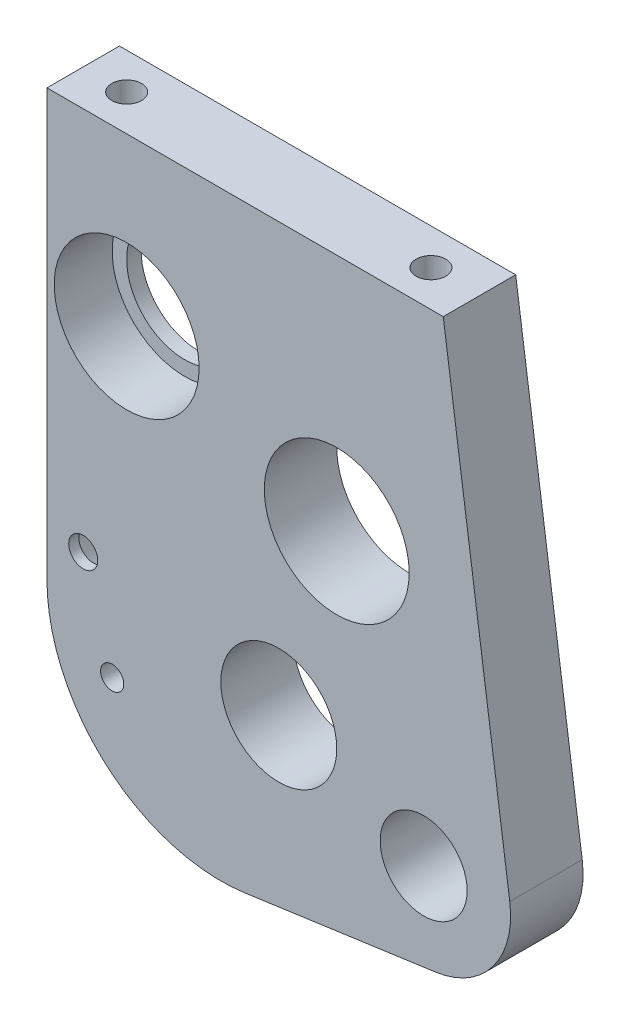
ISO-10303-21;
HEADER;
FILE_DESCRIPTION(('STEP AP214'),'2;1');
FILE_NAME('part.step','',(''),(''),'','','');
FILE_SCHEMA(('AUTOMOTIVE_DESIGN { 1 0 10303 214 1 1 1 1 }'));
ENDSEC;
DATA;
#1=APPLICATION_CONTEXT('core data for automotive mechanical design processes');
#2=APPLICATION_PROTOCOL_DEFINITION('international standard','automotive_design',2000,#1);
#3=PRODUCT_CONTEXT('',#1,'mechanical');
#4=PRODUCT('Part','Part','',(#3));
#5=PRODUCT_RELATED_PRODUCT_CATEGORY('part','',(#4));
#6=PRODUCT_DEFINITION_FORMATION('','',#4);
#7=PRODUCT_DEFINITION_CONTEXT('part definition',#1,'design');
#8=PRODUCT_DEFINITION('design','',#6,#7);
#9=PRODUCT_DEFINITION_SHAPE('','',#8);
#10=(LENGTH_UNIT() NAMED_UNIT(*) SI_UNIT(.MILLI.,.METRE.));
#11=(NAMED_UNIT(*) PLANE_ANGLE_UNIT() SI_UNIT($,.RADIAN.));
#12=(NAMED_UNIT(*) SI_UNIT($,.STERADIAN.) SOLID_ANGLE_UNIT());
#13=UNCERTAINTY_MEASURE_WITH_UNIT(LENGTH_MEASURE(1.E-05),#10,'distance_accuracy_value','');
#14=(GEOMETRIC_REPRESENTATION_CONTEXT(3) GLOBAL_UNCERTAINTY_ASSIGNED_CONTEXT((#13)) GLOBAL_UNIT_ASSIGNED_CONTEXT((#10,
#11,#12)) REPRESENTATION_CONTEXT('',''));
#15=CARTESIAN_POINT('',(0.,0.,0.));
#16=DIRECTION('',(0.,0.,1.));
#17=DIRECTION('',(1.,0.,0.));
#18=AXIS2_PLACEMENT_3D('',#15,#16,#17);
#19=CARTESIAN_POINT('',(24.,-7.35,2.5));
#20=DIRECTION('',(0.,1.,0.));
#21=DIRECTION('',(0.,0.,1.));
#22=AXIS2_PLACEMENT_3D('',#19,#20,#21);
#23=CONICAL_SURFACE('',#22,1.025,1.02974425867665);
#24=CARTESIAN_POINT('',(24.,-7.96588213450325,2.5));
#25=VERTEX_POINT('',#24);
#26=VERTEX_LOOP('',#25);
#27=FACE_BOUND('',#26,.T.);
#28=CARTESIAN_POINT('',(24.,-7.35,2.5));
#29=DIRECTION('',(0.,1.,0.));
#30=DIRECTION('',(0.,0.,1.));
#31=AXIS2_PLACEMENT_3D('',#28,#29,#30);
#32=CIRCLE('',#31,1.025);
#33=CARTESIAN_POINT('',(24.,-7.35,3.525));
#34=VERTEX_POINT('',#33);
#35=EDGE_CURVE('E283',#34,#34,#32,.T.);
#36=ORIENTED_EDGE('',*,*,#35,.T.);
#37=EDGE_LOOP('',(#36));
#38=FACE_BOUND('',#37,.T.);
#39=ADVANCED_FACE('F38',(#27,#38),#23,.F.);
#40=CARTESIAN_POINT('',(24.,0.,2.5));
#41=DIRECTION('',(0.,1.,0.));
#42=DIRECTION('',(0.,0.,1.));
#43=AXIS2_PLACEMENT_3D('',#40,#41,#42);
#44=CYLINDRICAL_SURFACE('',#43,1.025);
#45=ORIENTED_EDGE('',*,*,#35,.F.);
#46=EDGE_LOOP('',(#45));
#47=FACE_BOUND('',#46,.T.);
#48=CARTESIAN_POINT('',(24.,0.999999999999997,2.5));
#49=DIRECTION('',(0.,1.,0.));
#50=DIRECTION('',(-1.,0.,0.));
#51=AXIS2_PLACEMENT_3D('',#48,#49,#50);
#52=CIRCLE('',#51,1.025);
#53=CARTESIAN_POINT('',(22.975,0.999999999999997,2.5));
#54=VERTEX_POINT('',#53);
#55=EDGE_CURVE('E460',#54,#54,#52,.T.);
#56=ORIENTED_EDGE('',*,*,#55,.T.);
#57=EDGE_LOOP('',(#56));
#58=FACE_BOUND('',#57,.T.);
#59=ADVANCED_FACE('F322',(#47,#58),#44,.F.);
#60=CARTESIAN_POINT('',(2.5,-25.5,7.8284271247462));
#61=DIRECTION('',(0.,0.,-1.));
#62=DIRECTION('',(-1.,0.,0.));
#63=AXIS2_PLACEMENT_3D('',#60,#61,#62);
#64=CYLINDRICAL_SURFACE('',#63,1.);
#65=CARTESIAN_POINT('',(2.5,-25.5,5.));
#66=DIRECTION('',(0.,0.,1.));
#67=DIRECTION('',(1.,0.,0.));
#68=AXIS2_PLACEMENT_3D('',#65,#66,#67);
#69=CIRCLE('',#68,1.);
#70=CARTESIAN_POINT('',(3.5,-25.5,5.));
#71=VERTEX_POINT('',#70);
#72=EDGE_CURVE('E245',#71,#71,#69,.F.);
#73=ORIENTED_EDGE('',*,*,#72,.F.);
#74=EDGE_LOOP('',(#73));
#75=FACE_BOUND('',#74,.T.);
#76=CARTESIAN_POINT('',(2.5,-25.5,4.3));
#77=DIRECTION('',(0.,0.,-1.));
#78=DIRECTION('',(-1.,0.,0.));
#79=AXIS2_PLACEMENT_3D('',#76,#77,#78);
#80=CIRCLE('',#79,1.);
#81=CARTESIAN_POINT('',(1.5,-25.5,4.3));
#82=VERTEX_POINT('',#81);
#83=EDGE_CURVE('E42',#82,#82,#80,.F.);
#84=ORIENTED_EDGE('',*,*,#83,.F.);
#85=EDGE_LOOP('',(#84));
#86=FACE_BOUND('',#85,.T.);
#87=ADVANCED_FACE('F325',(#75,#86),#64,.F.);
#88=CARTESIAN_POINT('',(5.5,-10.5,-11.3137084989848));
#89=DIRECTION('',(0.,0.,1.));
#90=DIRECTION('',(1.,0.,0.));
#91=AXIS2_PLACEMENT_3D('',#88,#89,#90);
#92=CYLINDRICAL_SURFACE('',#91,4.);
#93=CARTESIAN_POINT('',(5.5,-10.5,0.));
#94=DIRECTION('',(0.,0.,1.));
#95=DIRECTION('',(1.,0.,0.));
#96=AXIS2_PLACEMENT_3D('',#93,#94,#95);
#97=CIRCLE('',#96,4.);
#98=CARTESIAN_POINT('',(9.5,-10.5,0.));
#99=VERTEX_POINT('',#98);
#100=EDGE_CURVE('E293',#99,#99,#97,.F.);
#101=ORIENTED_EDGE('',*,*,#100,.T.);
#102=EDGE_LOOP('',(#101));
#103=FACE_BOUND('',#102,.T.);
#104=CARTESIAN_POINT('',(5.5,-10.5,1.));
#105=DIRECTION('',(0.,0.,1.));
#106=DIRECTION('',(1.,0.,0.));
#107=AXIS2_PLACEMENT_3D('',#104,#105,#106);
#108=CIRCLE('',#107,4.);
#109=CARTESIAN_POINT('',(9.5,-10.5,1.));
#110=VERTEX_POINT('',#109);
#111=EDGE_CURVE('E290',#110,#110,#108,.F.);
#112=ORIENTED_EDGE('',*,*,#111,.F.);
#113=EDGE_LOOP('',(#112));
#114=FACE_BOUND('',#113,.T.);
#115=ADVANCED_FACE('F345',(#103,#114),#92,.F.);
#116=CARTESIAN_POINT('',(0.,0.,5.));
#117=DIRECTION('',(1.,0.,0.));
#118=DIRECTION('',(0.,1.,0.));
#119=AXIS2_PLACEMENT_3D('',#116,#117,#118);
#120=PLANE('',#119);
#121=DIRECTION('',(0.,-1.,0.));
#122=VECTOR('',#121,1.);
#123=CARTESIAN_POINT('',(0.,0.,0.));
#124=LINE('',#123,#122);
#125=CARTESIAN_POINT('',(0.,1.,0.));
#126=VERTEX_POINT('',#125);
#127=CARTESIAN_POINT('',(0.,-28.4086062507217,0.));
#128=VERTEX_POINT('',#127);
#129=EDGE_CURVE('E47',#126,#128,#124,.T.);
#130=ORIENTED_EDGE('',*,*,#129,.T.);
#131=DIRECTION('',(0.,0.,-1.));
#132=VECTOR('',#131,1.);
#133=CARTESIAN_POINT('',(0.,-28.4086062507217,37.9920643395449));
#134=LINE('',#133,#132);
#135=CARTESIAN_POINT('',(0.,-28.4086062507217,5.));
#136=VERTEX_POINT('',#135);
#137=EDGE_CURVE('E272',#136,#128,#134,.T.);
#138=ORIENTED_EDGE('',*,*,#137,.F.);
#139=DIRECTION('',(0.,-1.,0.));
#140=VECTOR('',#139,1.);
#141=CARTESIAN_POINT('',(0.,0.,5.));
#142=LINE('',#141,#140);
#143=CARTESIAN_POINT('',(0.,1.,5.));
#144=VERTEX_POINT('',#143);
#145=EDGE_CURVE('E11',#144,#136,#142,.T.);
#146=ORIENTED_EDGE('',*,*,#145,.F.);
#147=DIRECTION('',(0.,0.,-1.));
#148=VECTOR('',#147,1.);
#149=CARTESIAN_POINT('',(0.,1.,32.5095698087387));
#150=LINE('',#149,#148);
#151=EDGE_CURVE('E167',#144,#126,#150,.T.);
#152=ORIENTED_EDGE('',*,*,#151,.T.);
#153=EDGE_LOOP('',(#130,#138,#146,#152));
#154=FACE_BOUND('',#153,.T.);
#155=ADVANCED_FACE('F40',(#154),#120,.F.);
#156=CARTESIAN_POINT('',(0.,-38.5000000000001,5.));
#157=DIRECTION('',(0.,0.,1.));
#158=DIRECTION('',(1.,0.,0.));
#159=AXIS2_PLACEMENT_3D('',#156,#157,#158);
#160=PLANE('',#159);
#161=CARTESIAN_POINT('',(4.5,-32.,5.));
#162=DIRECTION('',(0.,0.,-1.));
#163=DIRECTION('',(-1.,0.,0.));
#164=AXIS2_PLACEMENT_3D('',#161,#162,#163);
#165=CIRCLE('',#164,0.799999999999999);
#166=CARTESIAN_POINT('',(3.7,-32.,5.));
#167=VERTEX_POINT('',#166);
#168=EDGE_CURVE('E458',#167,#167,#165,.T.);
#169=ORIENTED_EDGE('',*,*,#168,.T.);
#170=EDGE_LOOP('',(#169));
#171=FACE_BOUND('',#170,.T.);
#172=CARTESIAN_POINT('',(16.,-28.5,5.));
#173=DIRECTION('',(0.,0.,1.));
#174=DIRECTION('',(1.,0.,0.));
#175=AXIS2_PLACEMENT_3D('',#172,#173,#174);
#176=CIRCLE('',#175,4.);
#177=CARTESIAN_POINT('',(20.,-28.5,5.));
#178=VERTEX_POINT('',#177);
#179=EDGE_CURVE('E181',#178,#178,#176,.T.);
#180=ORIENTED_EDGE('',*,*,#179,.F.);
#181=EDGE_LOOP('',(#180));
#182=FACE_BOUND('',#181,.T.);
#183=CARTESIAN_POINT('',(20.,-15.5,5.));
#184=DIRECTION('',(0.,0.,1.));
#185=DIRECTION('',(1.,0.,0.));
#186=AXIS2_PLACEMENT_3D('',#183,#184,#185);
#187=CIRCLE('',#186,5.);
#188=CARTESIAN_POINT('',(25.,-15.5,5.));
#189=VERTEX_POINT('',#188);
#190=EDGE_CURVE('E184',#189,#189,#187,.T.);
#191=ORIENTED_EDGE('',*,*,#190,.F.);
#192=EDGE_LOOP('',(#191));
#193=FACE_BOUND('',#192,.T.);
#194=ORIENTED_EDGE('',*,*,#72,.T.);
#195=EDGE_LOOP('',(#194));
#196=FACE_BOUND('',#195,.T.);
#197=ORIENTED_EDGE('',*,*,#145,.T.);
#198=CARTESIAN_POINT('',(12.,-28.4086062507217,5.));
#199=DIRECTION('',(0.,0.,1.));
#200=DIRECTION('',(1.,0.,0.));
#201=AXIS2_PLACEMENT_3D('',#198,#199,#200);
#202=CIRCLE('',#201,12.);
#203=CARTESIAN_POINT('',(13.6700772115207,-40.2918230756206,5.));
#204=VERTEX_POINT('',#203);
#205=EDGE_CURVE('E269',#204,#136,#202,.F.);
#206=ORIENTED_EDGE('',*,*,#205,.F.);
#207=DIRECTION('',(-0.990268068741571,-0.139173100960058,0.));
#208=VECTOR('',#207,1.);
#209=CARTESIAN_POINT('',(26.8350386057604,-38.4416084124495,5.));
#210=LINE('',#209,#208);
#211=CARTESIAN_POINT('',(26.8350386057604,-38.4416084124495,5.));
#212=VERTEX_POINT('',#211);
#213=EDGE_CURVE('E264',#212,#204,#210,.T.);
#214=ORIENTED_EDGE('',*,*,#213,.F.);
#215=CARTESIAN_POINT('',(26.,-32.5,5.));
#216=DIRECTION('',(0.,0.,1.));
#217=DIRECTION('',(1.,0.,0.));
#218=AXIS2_PLACEMENT_3D('',#215,#216,#217);
#219=CIRCLE('',#218,6.00000000000006);
#220=CARTESIAN_POINT('',(31.9416084124495,-31.6649613942396,5.));
#221=VERTEX_POINT('',#220);
#222=EDGE_CURVE('E152',#212,#221,#219,.T.);
#223=ORIENTED_EDGE('',*,*,#222,.T.);
#224=DIRECTION('',(-0.139173100960066,0.99026806874157,0.));
#225=VECTOR('',#224,1.);
#226=CARTESIAN_POINT('',(31.9416084124494,-31.6649613942396,5.));
#227=LINE('',#226,#225);
#228=CARTESIAN_POINT('',(27.3508474725816,0.999999999999997,5.));
#229=VERTEX_POINT('',#228);
#230=EDGE_CURVE('E144',#221,#229,#227,.T.);
#231=ORIENTED_EDGE('',*,*,#230,.T.);
#232=DIRECTION('',(1.,0.,0.));
#233=VECTOR('',#232,1.);
#234=CARTESIAN_POINT('',(0.,1.,5.));
#235=LINE('',#234,#233);
#236=EDGE_CURVE('E149',#144,#229,#235,.T.);
#237=ORIENTED_EDGE('',*,*,#236,.F.);
#238=EDGE_LOOP('',(#197,#206,#214,#223,#231,#237));
#239=FACE_BOUND('',#238,.T.);
#240=CARTESIAN_POINT('',(5.5,-10.5,5.));
#241=DIRECTION('',(0.,0.,1.));
#242=DIRECTION('',(1.,0.,0.));
#243=AXIS2_PLACEMENT_3D('',#240,#241,#242);
#244=CIRCLE('',#243,5.);
#245=CARTESIAN_POINT('',(10.5,-10.5,5.));
#246=VERTEX_POINT('',#245);
#247=EDGE_CURVE('E286',#246,#246,#244,.T.);
#248=ORIENTED_EDGE('',*,*,#247,.F.);
#249=EDGE_LOOP('',(#248));
#250=FACE_BOUND('',#249,.T.);
#251=CARTESIAN_POINT('',(26.,-32.5,5.));
#252=DIRECTION('',(0.,0.,1.));
#253=DIRECTION('',(1.,0.,0.));
#254=AXIS2_PLACEMENT_3D('',#251,#252,#253);
#255=CIRCLE('',#254,3.);
#256=CARTESIAN_POINT('',(29.,-32.5,5.));
#257=VERTEX_POINT('',#256);
#258=EDGE_CURVE('E296',#257,#257,#255,.T.);
#259=ORIENTED_EDGE('',*,*,#258,.F.);
#260=EDGE_LOOP('',(#259));
#261=FACE_BOUND('',#260,.T.);
#262=ADVANCED_FACE('F146',(#171,#182,#193,#196,#239,#250,#261),#160,.T.);
#263=CARTESIAN_POINT('',(0.,-38.5000000000001,0.));
#264=DIRECTION('',(0.,0.,1.));
#265=DIRECTION('',(1.,0.,0.));
#266=AXIS2_PLACEMENT_3D('',#263,#264,#265);
#267=PLANE('',#266);
#268=CARTESIAN_POINT('',(4.5,-32.,0.));
#269=DIRECTION('',(0.,0.,-1.));
#270=DIRECTION('',(-1.,0.,0.));
#271=AXIS2_PLACEMENT_3D('',#268,#269,#270);
#272=CIRCLE('',#271,0.799999999999988);
#273=CARTESIAN_POINT('',(3.70000000000001,-32.,0.));
#274=VERTEX_POINT('',#273);
#275=EDGE_CURVE('E365',#274,#274,#272,.T.);
#276=ORIENTED_EDGE('',*,*,#275,.F.);
#277=EDGE_LOOP('',(#276));
#278=FACE_BOUND('',#277,.T.);
#279=CARTESIAN_POINT('',(16.,-28.5,0.));
#280=DIRECTION('',(0.,0.,-1.));
#281=DIRECTION('',(-1.,0.,0.));
#282=AXIS2_PLACEMENT_3D('',#279,#280,#281);
#283=CIRCLE('',#282,4.);
#284=CARTESIAN_POINT('',(12.,-28.5,0.));
#285=VERTEX_POINT('',#284);
#286=EDGE_CURVE('E178',#285,#285,#283,.T.);
#287=ORIENTED_EDGE('',*,*,#286,.F.);
#288=EDGE_LOOP('',(#287));
#289=FACE_BOUND('',#288,.T.);
#290=CARTESIAN_POINT('',(20.,-15.5,0.));
#291=DIRECTION('',(0.,0.,1.));
#292=DIRECTION('',(1.,0.,0.));
#293=AXIS2_PLACEMENT_3D('',#290,#291,#292);
#294=CIRCLE('',#293,5.);
#295=CARTESIAN_POINT('',(25.,-15.5,0.));
#296=VERTEX_POINT('',#295);
#297=EDGE_CURVE('E187',#296,#296,#294,.F.);
#298=ORIENTED_EDGE('',*,*,#297,.F.);
#299=EDGE_LOOP('',(#298));
#300=FACE_BOUND('',#299,.T.);
#301=DIRECTION('',(0.,1.,0.));
#302=VECTOR('',#301,1.);
#303=CARTESIAN_POINT('',(0.900000000000018,-28.2,0.));
#304=LINE('',#303,#302);
#305=CARTESIAN_POINT('',(0.900000000000018,-28.2,0.));
#306=VERTEX_POINT('',#305);
#307=CARTESIAN_POINT('',(0.899999999999967,-21.,0.));
#308=VERTEX_POINT('',#307);
#309=EDGE_CURVE('E223',#306,#308,#304,.T.);
#310=ORIENTED_EDGE('',*,*,#309,.F.);
#311=CARTESIAN_POINT('',(1.90000000000002,-28.2,0.));
#312=DIRECTION('',(0.,0.,-1.));
#313=DIRECTION('',(1.,0.,0.));
#314=AXIS2_PLACEMENT_3D('',#311,#312,#313);
#315=CIRCLE('',#314,0.999999999999998);
#316=CARTESIAN_POINT('',(1.90000000000002,-29.2,0.));
#317=VERTEX_POINT('',#316);
#318=EDGE_CURVE('E55',#317,#306,#315,.T.);
#319=ORIENTED_EDGE('',*,*,#318,.F.);
#320=DIRECTION('',(-1.,0.,0.));
#321=VECTOR('',#320,1.);
#322=CARTESIAN_POINT('',(1.90000000000002,-29.2,0.));
#323=LINE('',#322,#321);
#324=CARTESIAN_POINT('',(6.10000000000002,-29.2,0.));
#325=VERTEX_POINT('',#324);
#326=EDGE_CURVE('E200',#325,#317,#323,.T.);
#327=ORIENTED_EDGE('',*,*,#326,.F.);
#328=CARTESIAN_POINT('',(6.10000000000002,-28.2,0.));
#329=DIRECTION('',(0.,0.,-1.));
#330=DIRECTION('',(1.,0.,0.));
#331=AXIS2_PLACEMENT_3D('',#328,#329,#330);
#332=CIRCLE('',#331,0.999999999999998);
#333=CARTESIAN_POINT('',(7.10000000000002,-28.2,0.));
#334=VERTEX_POINT('',#333);
#335=EDGE_CURVE('E238',#334,#325,#332,.T.);
#336=ORIENTED_EDGE('',*,*,#335,.F.);
#337=DIRECTION('',(0.,-1.,0.));
#338=VECTOR('',#337,1.);
#339=CARTESIAN_POINT('',(7.10000000000002,-28.2,0.));
#340=LINE('',#339,#338);
#341=CARTESIAN_POINT('',(7.09999999999997,-21.,0.));
#342=VERTEX_POINT('',#341);
#343=EDGE_CURVE('E235',#342,#334,#340,.T.);
#344=ORIENTED_EDGE('',*,*,#343,.F.);
#345=CARTESIAN_POINT('',(6.09999999999997,-21.,0.));
#346=DIRECTION('',(0.,0.,-1.));
#347=DIRECTION('',(1.,0.,0.));
#348=AXIS2_PLACEMENT_3D('',#345,#346,#347);
#349=CIRCLE('',#348,1.);
#350=CARTESIAN_POINT('',(6.09999999999996,-20.,0.));
#351=VERTEX_POINT('',#350);
#352=EDGE_CURVE('E232',#351,#342,#349,.T.);
#353=ORIENTED_EDGE('',*,*,#352,.F.);
#354=DIRECTION('',(1.,0.,0.));
#355=VECTOR('',#354,1.);
#356=CARTESIAN_POINT('',(1.89999999999996,-20.,0.));
#357=LINE('',#356,#355);
#358=CARTESIAN_POINT('',(1.89999999999996,-20.,0.));
#359=VERTEX_POINT('',#358);
#360=EDGE_CURVE('E229',#359,#351,#357,.T.);
#361=ORIENTED_EDGE('',*,*,#360,.F.);
#362=CARTESIAN_POINT('',(1.89999999999997,-21.,0.));
#363=DIRECTION('',(0.,0.,-1.));
#364=DIRECTION('',(1.,0.,0.));
#365=AXIS2_PLACEMENT_3D('',#362,#363,#364);
#366=CIRCLE('',#365,1.);
#367=EDGE_CURVE('E226',#308,#359,#366,.T.);
#368=ORIENTED_EDGE('',*,*,#367,.F.);
#369=EDGE_LOOP('',(#310,#319,#327,#336,#344,#353,#361,#368));
#370=FACE_BOUND('',#369,.T.);
#371=ORIENTED_EDGE('',*,*,#100,.F.);
#372=EDGE_LOOP('',(#371));
#373=FACE_BOUND('',#372,.T.);
#374=CARTESIAN_POINT('',(26.,-32.5,0.));
#375=DIRECTION('',(0.,0.,1.));
#376=DIRECTION('',(1.,0.,0.));
#377=AXIS2_PLACEMENT_3D('',#374,#375,#376);
#378=CIRCLE('',#377,3.);
#379=CARTESIAN_POINT('',(29.,-32.5,0.));
#380=VERTEX_POINT('',#379);
#381=EDGE_CURVE('E299',#380,#380,#378,.F.);
#382=ORIENTED_EDGE('',*,*,#381,.F.);
#383=EDGE_LOOP('',(#382));
#384=FACE_BOUND('',#383,.T.);
#385=DIRECTION('',(-0.139173100960066,0.99026806874157,0.));
#386=VECTOR('',#385,1.);
#387=CARTESIAN_POINT('',(31.9416084124494,-31.6649613942396,0.));
#388=LINE('',#387,#386);
#389=CARTESIAN_POINT('',(31.9416084124494,-31.6649613942396,0.));
#390=VERTEX_POINT('',#389);
#391=CARTESIAN_POINT('',(27.3508474725816,0.999999999999997,0.));
#392=VERTEX_POINT('',#391);
#393=EDGE_CURVE('E163',#390,#392,#388,.T.);
#394=ORIENTED_EDGE('',*,*,#393,.F.);
#395=CARTESIAN_POINT('',(26.,-32.5,0.));
#396=DIRECTION('',(0.,0.,1.));
#397=DIRECTION('',(-1.,0.,0.));
#398=AXIS2_PLACEMENT_3D('',#395,#396,#397);
#399=CIRCLE('',#398,6.00000000000006);
#400=CARTESIAN_POINT('',(26.8350386057604,-38.4416084124495,0.));
#401=VERTEX_POINT('',#400);
#402=EDGE_CURVE('E278',#401,#390,#399,.T.);
#403=ORIENTED_EDGE('',*,*,#402,.F.);
#404=DIRECTION('',(-0.990268068741571,-0.139173100960058,0.));
#405=VECTOR('',#404,1.);
#406=CARTESIAN_POINT('',(26.8350386057604,-38.4416084124495,0.));
#407=LINE('',#406,#405);
#408=CARTESIAN_POINT('',(13.6700772115207,-40.2918230756206,0.));
#409=VERTEX_POINT('',#408);
#410=EDGE_CURVE('E63',#401,#409,#407,.T.);
#411=ORIENTED_EDGE('',*,*,#410,.T.);
#412=CARTESIAN_POINT('',(12.,-28.4086062507217,0.));
#413=DIRECTION('',(0.,0.,-1.));
#414=DIRECTION('',(1.,0.,0.));
#415=AXIS2_PLACEMENT_3D('',#412,#413,#414);
#416=CIRCLE('',#415,12.);
#417=EDGE_CURVE('E261',#409,#128,#416,.T.);
#418=ORIENTED_EDGE('',*,*,#417,.T.);
#419=ORIENTED_EDGE('',*,*,#129,.F.);
#420=DIRECTION('',(1.,0.,0.));
#421=VECTOR('',#420,1.);
#422=CARTESIAN_POINT('',(0.,1.,0.));
#423=LINE('',#422,#421);
#424=EDGE_CURVE('E171',#126,#392,#423,.T.);
#425=ORIENTED_EDGE('',*,*,#424,.T.);
#426=EDGE_LOOP('',(#394,#403,#411,#418,#419,#425));
#427=FACE_BOUND('',#426,.T.);
#428=ADVANCED_FACE('F338',(#278,#289,#300,#370,#373,#384,#427),#267,.F.);
#429=CARTESIAN_POINT('',(26.,-32.5,-8.48528137423856));
#430=DIRECTION('',(0.,0.,1.));
#431=DIRECTION('',(1.,0.,0.));
#432=AXIS2_PLACEMENT_3D('',#429,#430,#431);
#433=CYLINDRICAL_SURFACE('',#432,3.);
#434=ORIENTED_EDGE('',*,*,#381,.T.);
#435=EDGE_LOOP('',(#434));
#436=FACE_BOUND('',#435,.T.);
#437=ORIENTED_EDGE('',*,*,#258,.T.);
#438=EDGE_LOOP('',(#437));
#439=FACE_BOUND('',#438,.T.);
#440=ADVANCED_FACE('F331',(#436,#439),#433,.F.);
#441=CARTESIAN_POINT('',(5.5,-10.5,1.));
#442=DIRECTION('',(0.,0.,1.));
#443=DIRECTION('',(1.,0.,0.));
#444=AXIS2_PLACEMENT_3D('',#441,#442,#443);
#445=PLANE('',#444);
#446=CARTESIAN_POINT('',(5.5,-10.5,1.));
#447=DIRECTION('',(0.,0.,1.));
#448=DIRECTION('',(1.,0.,0.));
#449=AXIS2_PLACEMENT_3D('',#446,#447,#448);
#450=CIRCLE('',#449,5.);
#451=CARTESIAN_POINT('',(10.5,-10.5,1.));
#452=VERTEX_POINT('',#451);
#453=EDGE_CURVE('E287',#452,#452,#450,.T.);
#454=ORIENTED_EDGE('',*,*,#453,.T.);
#455=EDGE_LOOP('',(#454));
#456=FACE_BOUND('',#455,.T.);
#457=ORIENTED_EDGE('',*,*,#111,.T.);
#458=EDGE_LOOP('',(#457));
#459=FACE_BOUND('',#458,.T.);
#460=ADVANCED_FACE('F329',(#456,#459),#445,.T.);
#461=CARTESIAN_POINT('',(5.5,-10.5,1.));
#462=DIRECTION('',(0.,0.,1.));
#463=DIRECTION('',(1.,0.,0.));
#464=AXIS2_PLACEMENT_3D('',#461,#462,#463);
#465=CYLINDRICAL_SURFACE('',#464,5.);
#466=CARTESIAN_POINT('',(3.,-6.16987298107781,3.525));
#467=CARTESIAN_POINT('',(3.05862842312614,-6.13602713012205,3.52499726263906));
#468=CARTESIAN_POINT('',(3.11803416960404,-6.10332917433977,3.51995880752602));
#469=CARTESIAN_POINT('',(3.23674479733095,-6.04105556733151,3.49910828092649));
#470=CARTESIAN_POINT('',(3.29604925069393,-6.01148618067188,3.4832750488682));
#471=CARTESIAN_POINT('',(3.41269533731451,-5.95606525696224,3.44031044380091));
#472=CARTESIAN_POINT('',(3.47002663310431,-5.93023153295591,3.41312719613777));
#473=CARTESIAN_POINT('',(3.57990690861375,-5.88298584319343,3.34759412606573));
#474=CARTESIAN_POINT('',(3.63246070345389,-5.86156939711278,3.3092557141608));
#475=CARTESIAN_POINT('',(3.72537244577349,-5.82528691672348,3.22659272636324));
#476=CARTESIAN_POINT('',(3.76642287950783,-5.80998206524992,3.18323788301164));
#477=CARTESIAN_POINT('',(3.84078559390394,-5.78316055997319,3.08931110465425));
#478=CARTESIAN_POINT('',(3.87410044909567,-5.77164264528167,3.03874157988732));
#479=CARTESIAN_POINT('',(3.92944734815511,-5.75298415143666,2.93580117023767));
#480=CARTESIAN_POINT('',(3.95211535192408,-5.74558966255833,2.8838169873901));
#481=CARTESIAN_POINT('',(3.98862296638636,-5.73385793922175,2.77651230975277));
#482=CARTESIAN_POINT('',(4.00246436933311,-5.72952008409103,2.72119249476629));
#483=CARTESIAN_POINT('',(4.02054083906114,-5.72388355645132,2.61039792928099));
#484=CARTESIAN_POINT('',(4.02502514326714,-5.72250600200794,2.55496767484027));
#485=CARTESIAN_POINT('',(4.0249746505427,-5.72252153394439,2.44411283348655));
#486=CARTESIAN_POINT('',(4.02044040669371,-5.72391445041926,2.38868824643444));
#487=CARTESIAN_POINT('',(4.00257313447538,-5.72948659248111,2.27977544223498));
#488=CARTESIAN_POINT('',(3.9892946102308,-5.7336485598965,2.22627738155619));
#489=CARTESIAN_POINT('',(3.95447237213362,-5.74482636542971,2.12236256572465));
#490=CARTESIAN_POINT('',(3.93292889225474,-5.75184212275957,2.07194572339211));
#491=CARTESIAN_POINT('',(3.88223105643019,-5.7688755294127,1.97532428674937));
#492=CARTESIAN_POINT('',(3.85303913531411,-5.77890803237636,1.92914204559325));
#493=CARTESIAN_POINT('',(3.78816531893596,-5.80204252049333,1.84246553362818));
#494=CARTESIAN_POINT('',(3.75248321302552,-5.81514460527835,1.80197144751217));
#495=CARTESIAN_POINT('',(3.67504973265751,-5.84475476455951,1.72675322404664));
#496=CARTESIAN_POINT('',(3.63318108264913,-5.86133207248323,1.69217734489385));
#497=CARTESIAN_POINT('',(3.54546896105869,-5.89760280958102,1.63053792208927));
#498=CARTESIAN_POINT('',(3.499624765182,-5.91729680711832,1.60347575113042));
#499=CARTESIAN_POINT('',(3.40280283807754,-5.96075667699243,1.55583607794344));
#500=CARTESIAN_POINT('',(3.35168140156598,-5.98468815615573,1.53570324575169));
#501=CARTESIAN_POINT('',(3.24821020730876,-6.03538722554858,1.5040340011579));
#502=CARTESIAN_POINT('',(3.19585996437919,-6.06215595122118,1.49250104530526));
#503=CARTESIAN_POINT('',(3.08598799311623,-6.12086746536953,1.47695961057217));
#504=CARTESIAN_POINT('',(3.02847677473845,-6.15305981678705,1.47382656833948));
#505=CARTESIAN_POINT('',(2.91498507831851,-6.21957546534315,1.47695322828851));
#506=CARTESIAN_POINT('',(2.8590051475528,-6.25389951037037,1.48321624505666));
#507=CARTESIAN_POINT('',(2.74246874433345,-6.32850069124962,1.50588092511209));
#508=CARTESIAN_POINT('',(2.68227125777869,-6.36896929660904,1.52350145097755));
#509=CARTESIAN_POINT('',(2.56629910531524,-6.45050155400677,1.56918276065806));
#510=CARTESIAN_POINT('',(2.51053102031661,-6.49156598806032,1.59725873901517));
#511=CARTESIAN_POINT('',(2.39932835918812,-6.57683715066148,1.66661568638373));
#512=CARTESIAN_POINT('',(2.34446161716549,-6.62095763568085,1.70892079740678));
#513=CARTESIAN_POINT('',(2.24304874733696,-6.70571344159235,1.80535612183462));
#514=CARTESIAN_POINT('',(2.19648651221234,-6.74635542787296,1.85946298118295));
#515=CARTESIAN_POINT('',(2.12883525286075,-6.80723284469086,1.9578981179763));
#516=CARTESIAN_POINT('',(2.10459822229023,-6.82956078430608,1.99877860789132));
#517=CARTESIAN_POINT('',(2.06144821304688,-6.86995439021727,2.0851895417969));
#518=CARTESIAN_POINT('',(2.04252592449876,-6.88802750062729,2.13071166185743));
#519=CARTESIAN_POINT('',(2.01373940063223,-6.91582348600467,2.21777762351225));
#520=CARTESIAN_POINT('',(2.00288768367797,-6.92643892905585,2.25870587327519));
#521=CARTESIAN_POINT('',(1.98626915045228,-6.94277723494137,2.3425338365368));
#522=CARTESIAN_POINT('',(1.98049857930173,-6.94850371054301,2.38543206954377));
#523=CARTESIAN_POINT('',(1.97445343418953,-6.95450404751596,2.47216445409608));
#524=CARTESIAN_POINT('',(1.97419910818669,-6.95475782073727,2.51600146266214));
#525=CARTESIAN_POINT('',(1.97925953955343,-6.94973268590876,2.60303002068457));
#526=CARTESIAN_POINT('',(1.98457558978246,-6.94445249345017,2.64622141793711));
#527=CARTESIAN_POINT('',(1.9999537614986,-6.92931622018902,2.72845556825056));
#528=CARTESIAN_POINT('',(2.00975123141754,-6.9197157302878,2.76759701728881));
#529=CARTESIAN_POINT('',(2.0334360121992,-6.89677842140935,2.84345440371446));
#530=CARTESIAN_POINT('',(2.04732536807064,-6.88343973434985,2.88016911702774));
#531=CARTESIAN_POINT('',(2.0859118232888,-6.84692040937858,2.96719029327103));
#532=CARTESIAN_POINT('',(2.11263257104905,-6.82204587302376,3.01589072739036));
#533=CARTESIAN_POINT('',(2.17215182515039,-6.7681039648939,3.10684498689391));
#534=CARTESIAN_POINT('',(2.20496408927804,-6.7390271357743,3.14908381672487));
#535=CARTESIAN_POINT('',(2.28565385883148,-6.6696544110268,3.2381763520914));
#536=CARTESIAN_POINT('',(2.33515847267988,-6.62852477153388,3.28290746147041));
#537=CARTESIAN_POINT('',(2.44082604007817,-6.54449424974538,3.36156391019618));
#538=CARTESIAN_POINT('',(2.49699647599407,-6.50159141291268,3.39547694582618));
#539=CARTESIAN_POINT('',(2.61537121170639,-6.41535307260601,3.45238922350793));
#540=CARTESIAN_POINT('',(2.67763365473078,-6.3720178527344,3.47526777674777));
#541=CARTESIAN_POINT('',(2.80624051318678,-6.28697764862121,3.50869650458769));
#542=CARTESIAN_POINT('',(2.87257028909683,-6.24526761036659,3.51928844212533));
#543=CARTESIAN_POINT('',(2.95993275624307,-6.19319084676403,3.52441121415135));
#544=CARTESIAN_POINT('',(2.97992079033341,-6.18146459315686,3.52500093749826));
#545=CARTESIAN_POINT('',(3.,-6.16987298107781,3.525));
#546=B_SPLINE_CURVE_WITH_KNOTS('',3,(#466,#467,#468,#469,#470,#471,#472,#473,#474,#475,#476,
#477,#478,#479,#480,#481,#482,#483,#484,#485,#486,#487,#488,#489,#490,#491,#492,#493,#494,#495,
#496,#497,#498,#499,#500,#501,#502,#503,#504,#505,#506,#507,#508,#509,#510,#511,#512,#513,#514,
#515,#516,#517,#518,#519,#520,#521,#522,#523,#524,#525,#526,#527,#528,#529,#530,#531,#532,#533,
#534,#535,#536,#537,#538,#539,#540,#541,#542,#543,#544,#545),.UNSPECIFIED.,.T.,.F.,(4,2,2,2,2,2,
2,2,2,2,2,2,2,2,2,2,2,2,2,2,2,2,2,2,2,2,2,2,2,2,2,2,2,2,2,2,2,2,2,4),(0.,0.203029005919236,
0.406457150182527,0.610825409632835,0.814985353389807,0.998913205559827,1.18277975544069,
1.35351245727374,1.52421048054919,1.69030049092007,1.85638031578536,2.02143462142456,
2.18648425486438,2.35236023847841,2.51824160679936,2.68781010501417,2.85740956165069,
3.03644702758999,3.21555641535061,3.41271615882861,3.6099454694193,3.83296957358191,
4.05631906377666,4.30154794982594,4.54629589406201,4.7033061385701,4.86003960684861,
4.99045395629774,5.12077185071358,5.25156801005755,5.38239453333128,5.50633218442374,
5.63033188142591,5.81191626403767,5.99391586037351,6.22785063044491,6.46205052064306,
6.69875692345847,6.93465636744944,7.0041902515432),.UNSPECIFIED.);
#547=CARTESIAN_POINT('',(3.,-6.16987298107781,3.525));
#548=VERTEX_POINT('',#547);
#549=EDGE_CURVE('E156',#548,#548,#546,.T.);
#550=ORIENTED_EDGE('',*,*,#549,.T.);
#551=EDGE_LOOP('',(#550));
#552=FACE_BOUND('',#551,.T.);
#553=ORIENTED_EDGE('',*,*,#453,.F.);
#554=EDGE_LOOP('',(#553));
#555=FACE_BOUND('',#554,.T.);
#556=ORIENTED_EDGE('',*,*,#247,.T.);
#557=EDGE_LOOP('',(#556));
#558=FACE_BOUND('',#557,.T.);
#559=ADVANCED_FACE('F310',(#552,#555,#558),#465,.F.);
#560=CARTESIAN_POINT('',(3.,0.,2.5));
#561=DIRECTION('',(0.,1.,0.));
#562=DIRECTION('',(0.,0.,1.));
#563=AXIS2_PLACEMENT_3D('',#560,#561,#562);
#564=CYLINDRICAL_SURFACE('',#563,1.025);
#565=ORIENTED_EDGE('',*,*,#549,.F.);
#566=EDGE_LOOP('',(#565));
#567=FACE_BOUND('',#566,.T.);
#568=CARTESIAN_POINT('',(3.,1.,2.5));
#569=DIRECTION('',(0.,1.,0.));
#570=DIRECTION('',(-1.,0.,0.));
#571=AXIS2_PLACEMENT_3D('',#568,#569,#570);
#572=CIRCLE('',#571,1.025);
#573=CARTESIAN_POINT('',(1.975,1.,2.5));
#574=VERTEX_POINT('',#573);
#575=EDGE_CURVE('E173',#574,#574,#572,.T.);
#576=ORIENTED_EDGE('',*,*,#575,.T.);
#577=EDGE_LOOP('',(#576));
#578=FACE_BOUND('',#577,.T.);
#579=ADVANCED_FACE('F314',(#567,#578),#564,.F.);
#580=CARTESIAN_POINT('',(26.,-32.5,44.3223854820636));
#581=DIRECTION('',(0.,0.,-1.));
#582=DIRECTION('',(-1.,0.,0.));
#583=AXIS2_PLACEMENT_3D('',#580,#581,#582);
#584=CYLINDRICAL_SURFACE('',#583,6.00000000000006);
#585=DIRECTION('',(0.,0.,-1.));
#586=VECTOR('',#585,1.);
#587=CARTESIAN_POINT('',(31.9416084124495,-31.6649613942396,44.3223854820636));
#588=LINE('',#587,#586);
#589=EDGE_CURVE('E157',#221,#390,#588,.T.);
#590=ORIENTED_EDGE('',*,*,#589,.F.);
#591=ORIENTED_EDGE('',*,*,#222,.F.);
#592=DIRECTION('',(0.,0.,-1.));
#593=VECTOR('',#592,1.);
#594=CARTESIAN_POINT('',(26.8350386057604,-38.4416084124495,37.9920643395449));
#595=LINE('',#594,#593);
#596=EDGE_CURVE('E275',#212,#401,#595,.T.);
#597=ORIENTED_EDGE('',*,*,#596,.T.);
#598=ORIENTED_EDGE('',*,*,#402,.T.);
#599=EDGE_LOOP('',(#590,#591,#597,#598));
#600=FACE_BOUND('',#599,.T.);
#601=ADVANCED_FACE('F319',(#600),#584,.T.);
#602=CARTESIAN_POINT('',(31.9416084124494,-31.6649613942396,44.3223854820636));
#603=DIRECTION('',(-0.99026806874157,-0.139173100960066,0.));
#604=DIRECTION('',(0.139173100960066,-0.99026806874157,0.));
#605=AXIS2_PLACEMENT_3D('',#602,#603,#604);
#606=PLANE('',#605);
#607=ORIENTED_EDGE('',*,*,#589,.T.);
#608=ORIENTED_EDGE('',*,*,#393,.T.);
#609=DIRECTION('',(0.,0.,-1.));
#610=VECTOR('',#609,1.);
#611=CARTESIAN_POINT('',(27.3508474725816,0.999999999999997,32.5095698087387));
#612=LINE('',#611,#610);
#613=EDGE_CURVE('E160',#229,#392,#612,.T.);
#614=ORIENTED_EDGE('',*,*,#613,.F.);
#615=ORIENTED_EDGE('',*,*,#230,.F.);
#616=EDGE_LOOP('',(#607,#608,#614,#615));
#617=FACE_BOUND('',#616,.T.);
#618=ADVANCED_FACE('F161',(#617),#606,.F.);
#619=CARTESIAN_POINT('',(26.8350386057604,-38.4416084124495,37.9920643395449));
#620=DIRECTION('',(0.139173100960058,-0.990268068741571,0.));
#621=DIRECTION('',(0.990268068741571,0.139173100960058,0.));
#622=AXIS2_PLACEMENT_3D('',#619,#620,#621);
#623=PLANE('',#622);
#624=ORIENTED_EDGE('',*,*,#596,.F.);
#625=ORIENTED_EDGE('',*,*,#213,.T.);
#626=DIRECTION('',(0.,0.,-1.));
#627=VECTOR('',#626,1.);
#628=CARTESIAN_POINT('',(13.6700772115207,-40.2918230756206,37.9920643395449));
#629=LINE('',#628,#627);
#630=EDGE_CURVE('E268',#204,#409,#629,.T.);
#631=ORIENTED_EDGE('',*,*,#630,.T.);
#632=ORIENTED_EDGE('',*,*,#410,.F.);
#633=EDGE_LOOP('',(#624,#625,#631,#632));
#634=FACE_BOUND('',#633,.T.);
#635=ADVANCED_FACE('F383',(#634),#623,.T.);
#636=CARTESIAN_POINT('',(12.,-28.4086062507217,37.9920643395449));
#637=DIRECTION('',(0.,0.,-1.));
#638=DIRECTION('',(-1.,0.,0.));
#639=AXIS2_PLACEMENT_3D('',#636,#637,#638);
#640=CYLINDRICAL_SURFACE('',#639,12.);
#641=ORIENTED_EDGE('',*,*,#630,.F.);
#642=ORIENTED_EDGE('',*,*,#205,.T.);
#643=ORIENTED_EDGE('',*,*,#137,.T.);
#644=ORIENTED_EDGE('',*,*,#417,.F.);
#645=EDGE_LOOP('',(#641,#642,#643,#644));
#646=FACE_BOUND('',#645,.T.);
#647=ADVANCED_FACE('F382',(#646),#640,.T.);
#648=CARTESIAN_POINT('',(1.90000000000002,-28.2,2.5));
#649=DIRECTION('',(0.,0.,1.));
#650=DIRECTION('',(1.,0.,0.));
#651=AXIS2_PLACEMENT_3D('',#648,#649,#650);
#652=PLANE('',#651);
#653=CARTESIAN_POINT('',(4.,-25.5,2.5));
#654=DIRECTION('',(0.,0.,-1.));
#655=DIRECTION('',(-1.,0.,0.));
#656=AXIS2_PLACEMENT_3D('',#653,#654,#655);
#657=CIRCLE('',#656,3.);
#658=CARTESIAN_POINT('',(0.999999999999999,-25.5,2.5));
#659=VERTEX_POINT('',#658);
#660=EDGE_CURVE('E190',#659,#659,#657,.T.);
#661=ORIENTED_EDGE('',*,*,#660,.F.);
#662=EDGE_LOOP('',(#661));
#663=FACE_BOUND('',#662,.T.);
#664=CARTESIAN_POINT('',(1.90000000000002,-28.2,2.5));
#665=DIRECTION('',(0.,0.,-1.));
#666=DIRECTION('',(1.,0.,0.));
#667=AXIS2_PLACEMENT_3D('',#664,#665,#666);
#668=CIRCLE('',#667,0.999999999999998);
#669=CARTESIAN_POINT('',(1.90000000000002,-29.2,2.5));
#670=VERTEX_POINT('',#669);
#671=CARTESIAN_POINT('',(0.900000000000018,-28.2,2.5));
#672=VERTEX_POINT('',#671);
#673=EDGE_CURVE('E196',#670,#672,#668,.T.);
#674=ORIENTED_EDGE('',*,*,#673,.T.);
#675=DIRECTION('',(0.,1.,0.));
#676=VECTOR('',#675,1.);
#677=CARTESIAN_POINT('',(0.900000000000018,-28.2,2.5));
#678=LINE('',#677,#676);
#679=CARTESIAN_POINT('',(0.899999999999967,-21.,2.5));
#680=VERTEX_POINT('',#679);
#681=EDGE_CURVE('E199',#672,#680,#678,.T.);
#682=ORIENTED_EDGE('',*,*,#681,.T.);
#683=CARTESIAN_POINT('',(1.89999999999997,-21.,2.5));
#684=DIRECTION('',(0.,0.,-1.));
#685=DIRECTION('',(1.,0.,0.));
#686=AXIS2_PLACEMENT_3D('',#683,#684,#685);
#687=CIRCLE('',#686,1.);
#688=CARTESIAN_POINT('',(1.89999999999996,-20.,2.5));
#689=VERTEX_POINT('',#688);
#690=EDGE_CURVE('E203',#680,#689,#687,.T.);
#691=ORIENTED_EDGE('',*,*,#690,.T.);
#692=DIRECTION('',(1.,0.,0.));
#693=VECTOR('',#692,1.);
#694=CARTESIAN_POINT('',(1.89999999999996,-20.,2.5));
#695=LINE('',#694,#693);
#696=CARTESIAN_POINT('',(6.09999999999996,-20.,2.5));
#697=VERTEX_POINT('',#696);
#698=EDGE_CURVE('E206',#689,#697,#695,.T.);
#699=ORIENTED_EDGE('',*,*,#698,.T.);
#700=CARTESIAN_POINT('',(6.09999999999997,-21.,2.5));
#701=DIRECTION('',(0.,0.,-1.));
#702=DIRECTION('',(1.,0.,0.));
#703=AXIS2_PLACEMENT_3D('',#700,#701,#702);
#704=CIRCLE('',#703,1.);
#705=CARTESIAN_POINT('',(7.09999999999997,-21.,2.5));
#706=VERTEX_POINT('',#705);
#707=EDGE_CURVE('E209',#697,#706,#704,.T.);
#708=ORIENTED_EDGE('',*,*,#707,.T.);
#709=DIRECTION('',(0.,-1.,0.));
#710=VECTOR('',#709,1.);
#711=CARTESIAN_POINT('',(7.10000000000002,-28.2,2.5));
#712=LINE('',#711,#710);
#713=CARTESIAN_POINT('',(7.10000000000002,-28.2,2.5));
#714=VERTEX_POINT('',#713);
#715=EDGE_CURVE('E212',#706,#714,#712,.T.);
#716=ORIENTED_EDGE('',*,*,#715,.T.);
#717=CARTESIAN_POINT('',(6.10000000000002,-28.2,2.5));
#718=DIRECTION('',(0.,0.,-1.));
#719=DIRECTION('',(1.,0.,0.));
#720=AXIS2_PLACEMENT_3D('',#717,#718,#719);
#721=CIRCLE('',#720,0.999999999999998);
#722=CARTESIAN_POINT('',(6.10000000000002,-29.2,2.5));
#723=VERTEX_POINT('',#722);
#724=EDGE_CURVE('E215',#714,#723,#721,.T.);
#725=ORIENTED_EDGE('',*,*,#724,.T.);
#726=DIRECTION('',(-1.,0.,0.));
#727=VECTOR('',#726,1.);
#728=CARTESIAN_POINT('',(1.90000000000002,-29.2,2.5));
#729=LINE('',#728,#727);
#730=EDGE_CURVE('E218',#723,#670,#729,.T.);
#731=ORIENTED_EDGE('',*,*,#730,.T.);
#732=EDGE_LOOP('',(#674,#682,#691,#699,#708,#716,#725,#731));
#733=FACE_BOUND('',#732,.T.);
#734=ADVANCED_FACE('F395',(#663,#733),#652,.F.);
#735=CARTESIAN_POINT('',(1.90000000000002,-28.2,2.5));
#736=DIRECTION('',(0.,0.,-1.));
#737=DIRECTION('',(-1.,0.,0.));
#738=AXIS2_PLACEMENT_3D('',#735,#736,#737);
#739=CYLINDRICAL_SURFACE('',#738,0.999999999999998);
#740=ORIENTED_EDGE('',*,*,#318,.T.);
#741=DIRECTION('',(0.,0.,-1.));
#742=VECTOR('',#741,1.);
#743=CARTESIAN_POINT('',(0.900000000000018,-28.2,2.5));
#744=LINE('',#743,#742);
#745=EDGE_CURVE('E221',#672,#306,#744,.T.);
#746=ORIENTED_EDGE('',*,*,#745,.F.);
#747=ORIENTED_EDGE('',*,*,#673,.F.);
#748=DIRECTION('',(0.,0.,-1.));
#749=VECTOR('',#748,1.);
#750=CARTESIAN_POINT('',(1.90000000000002,-29.2,2.5));
#751=LINE('',#750,#749);
#752=EDGE_CURVE('E243',#670,#317,#751,.T.);
#753=ORIENTED_EDGE('',*,*,#752,.T.);
#754=EDGE_LOOP('',(#740,#746,#747,#753));
#755=FACE_BOUND('',#754,.T.);
#756=ADVANCED_FACE('F397',(#755),#739,.F.);
#757=CARTESIAN_POINT('',(1.90000000000002,-29.2,2.5));
#758=DIRECTION('',(0.,-1.,0.));
#759=DIRECTION('',(1.,0.,0.));
#760=AXIS2_PLACEMENT_3D('',#757,#758,#759);
#761=PLANE('',#760);
#762=ORIENTED_EDGE('',*,*,#326,.T.);
#763=ORIENTED_EDGE('',*,*,#752,.F.);
#764=ORIENTED_EDGE('',*,*,#730,.F.);
#765=DIRECTION('',(0.,0.,-1.));
#766=VECTOR('',#765,1.);
#767=CARTESIAN_POINT('',(6.10000000000002,-29.2,2.5));
#768=LINE('',#767,#766);
#769=EDGE_CURVE('E246',#723,#325,#768,.T.);
#770=ORIENTED_EDGE('',*,*,#769,.T.);
#771=EDGE_LOOP('',(#762,#763,#764,#770));
#772=FACE_BOUND('',#771,.T.);
#773=ADVANCED_FACE('F400',(#772),#761,.F.);
#774=CARTESIAN_POINT('',(6.10000000000002,-28.2,2.5));
#775=DIRECTION('',(0.,0.,-1.));
#776=DIRECTION('',(-1.,0.,0.));
#777=AXIS2_PLACEMENT_3D('',#774,#775,#776);
#778=CYLINDRICAL_SURFACE('',#777,0.999999999999998);
#779=ORIENTED_EDGE('',*,*,#335,.T.);
#780=ORIENTED_EDGE('',*,*,#769,.F.);
#781=ORIENTED_EDGE('',*,*,#724,.F.);
#782=DIRECTION('',(0.,0.,-1.));
#783=VECTOR('',#782,1.);
#784=CARTESIAN_POINT('',(7.10000000000002,-28.2,2.5));
#785=LINE('',#784,#783);
#786=EDGE_CURVE('E248',#714,#334,#785,.T.);
#787=ORIENTED_EDGE('',*,*,#786,.T.);
#788=EDGE_LOOP('',(#779,#780,#781,#787));
#789=FACE_BOUND('',#788,.T.);
#790=ADVANCED_FACE('F421',(#789),#778,.F.);
#791=CARTESIAN_POINT('',(7.10000000000002,-28.2,2.5));
#792=DIRECTION('',(1.,0.,0.));
#793=DIRECTION('',(0.,1.,0.));
#794=AXIS2_PLACEMENT_3D('',#791,#792,#793);
#795=PLANE('',#794);
#796=ORIENTED_EDGE('',*,*,#343,.T.);
#797=ORIENTED_EDGE('',*,*,#786,.F.);
#798=ORIENTED_EDGE('',*,*,#715,.F.);
#799=DIRECTION('',(0.,0.,-1.));
#800=VECTOR('',#799,1.);
#801=CARTESIAN_POINT('',(7.09999999999997,-21.,2.5));
#802=LINE('',#801,#800);
#803=EDGE_CURVE('E250',#706,#342,#802,.T.);
#804=ORIENTED_EDGE('',*,*,#803,.T.);
#805=EDGE_LOOP('',(#796,#797,#798,#804));
#806=FACE_BOUND('',#805,.T.);
#807=ADVANCED_FACE('F417',(#806),#795,.F.);
#808=CARTESIAN_POINT('',(6.09999999999997,-21.,2.5));
#809=DIRECTION('',(0.,0.,-1.));
#810=DIRECTION('',(-1.,0.,0.));
#811=AXIS2_PLACEMENT_3D('',#808,#809,#810);
#812=CYLINDRICAL_SURFACE('',#811,1.);
#813=ORIENTED_EDGE('',*,*,#352,.T.);
#814=ORIENTED_EDGE('',*,*,#803,.F.);
#815=ORIENTED_EDGE('',*,*,#707,.F.);
#816=DIRECTION('',(0.,0.,-1.));
#817=VECTOR('',#816,1.);
#818=CARTESIAN_POINT('',(6.09999999999996,-20.,2.5));
#819=LINE('',#818,#817);
#820=EDGE_CURVE('E252',#697,#351,#819,.T.);
#821=ORIENTED_EDGE('',*,*,#820,.T.);
#822=EDGE_LOOP('',(#813,#814,#815,#821));
#823=FACE_BOUND('',#822,.T.);
#824=ADVANCED_FACE('F413',(#823),#812,.F.);
#825=CARTESIAN_POINT('',(1.89999999999996,-20.,2.5));
#826=DIRECTION('',(0.,1.,0.));
#827=DIRECTION('',(-1.,0.,0.));
#828=AXIS2_PLACEMENT_3D('',#825,#826,#827);
#829=PLANE('',#828);
#830=ORIENTED_EDGE('',*,*,#360,.T.);
#831=ORIENTED_EDGE('',*,*,#820,.F.);
#832=ORIENTED_EDGE('',*,*,#698,.F.);
#833=DIRECTION('',(0.,0.,-1.));
#834=VECTOR('',#833,1.);
#835=CARTESIAN_POINT('',(1.89999999999996,-20.,2.5));
#836=LINE('',#835,#834);
#837=EDGE_CURVE('E254',#689,#359,#836,.T.);
#838=ORIENTED_EDGE('',*,*,#837,.T.);
#839=EDGE_LOOP('',(#830,#831,#832,#838));
#840=FACE_BOUND('',#839,.T.);
#841=ADVANCED_FACE('F409',(#840),#829,.F.);
#842=CARTESIAN_POINT('',(1.89999999999997,-21.,2.5));
#843=DIRECTION('',(0.,0.,-1.));
#844=DIRECTION('',(-1.,0.,0.));
#845=AXIS2_PLACEMENT_3D('',#842,#843,#844);
#846=CYLINDRICAL_SURFACE('',#845,1.);
#847=ORIENTED_EDGE('',*,*,#367,.T.);
#848=ORIENTED_EDGE('',*,*,#837,.F.);
#849=ORIENTED_EDGE('',*,*,#690,.F.);
#850=DIRECTION('',(0.,0.,-1.));
#851=VECTOR('',#850,1.);
#852=CARTESIAN_POINT('',(0.899999999999967,-21.,2.5));
#853=LINE('',#852,#851);
#854=EDGE_CURVE('E256',#680,#308,#853,.T.);
#855=ORIENTED_EDGE('',*,*,#854,.T.);
#856=EDGE_LOOP('',(#847,#848,#849,#855));
#857=FACE_BOUND('',#856,.T.);
#858=ADVANCED_FACE('F405',(#857),#846,.F.);
#859=CARTESIAN_POINT('',(0.900000000000018,-28.2,2.5));
#860=DIRECTION('',(-1.,0.,0.));
#861=DIRECTION('',(0.,-1.,0.));
#862=AXIS2_PLACEMENT_3D('',#859,#860,#861);
#863=PLANE('',#862);
#864=ORIENTED_EDGE('',*,*,#309,.T.);
#865=ORIENTED_EDGE('',*,*,#854,.F.);
#866=ORIENTED_EDGE('',*,*,#681,.F.);
#867=ORIENTED_EDGE('',*,*,#745,.T.);
#868=EDGE_LOOP('',(#864,#865,#866,#867));
#869=FACE_BOUND('',#868,.T.);
#870=ADVANCED_FACE('F401',(#869),#863,.F.);
#871=CARTESIAN_POINT('',(4.,-25.5,4.3));
#872=DIRECTION('',(0.,0.,-1.));
#873=DIRECTION('',(-1.,0.,0.));
#874=AXIS2_PLACEMENT_3D('',#871,#872,#873);
#875=PLANE('',#874);
#876=CARTESIAN_POINT('',(4.,-25.5,4.3));
#877=DIRECTION('',(0.,0.,-1.));
#878=DIRECTION('',(-1.,0.,0.));
#879=AXIS2_PLACEMENT_3D('',#876,#877,#878);
#880=CIRCLE('',#879,3.);
#881=CARTESIAN_POINT('',(0.999999999999999,-25.5,4.3));
#882=VERTEX_POINT('',#881);
#883=EDGE_CURVE('E191',#882,#882,#880,.T.);
#884=ORIENTED_EDGE('',*,*,#883,.T.);
#885=EDGE_LOOP('',(#884));
#886=FACE_BOUND('',#885,.T.);
#887=ORIENTED_EDGE('',*,*,#83,.T.);
#888=EDGE_LOOP('',(#887));
#889=FACE_BOUND('',#888,.T.);
#890=ADVANCED_FACE('F404',(#886,#889),#875,.T.);
#891=CARTESIAN_POINT('',(4.,-25.5,4.3));
#892=DIRECTION('',(0.,0.,-1.));
#893=DIRECTION('',(-1.,0.,0.));
#894=AXIS2_PLACEMENT_3D('',#891,#892,#893);
#895=CYLINDRICAL_SURFACE('',#894,3.);
#896=ORIENTED_EDGE('',*,*,#883,.F.);
#897=EDGE_LOOP('',(#896));
#898=FACE_BOUND('',#897,.T.);
#899=ORIENTED_EDGE('',*,*,#660,.T.);
#900=EDGE_LOOP('',(#899));
#901=FACE_BOUND('',#900,.T.);
#902=ADVANCED_FACE('F432',(#898,#901),#895,.F.);
#903=CARTESIAN_POINT('',(20.,-15.5,-14.142135623731));
#904=DIRECTION('',(0.,0.,1.));
#905=DIRECTION('',(1.,0.,0.));
#906=AXIS2_PLACEMENT_3D('',#903,#904,#905);
#907=CYLINDRICAL_SURFACE('',#906,5.);
#908=ORIENTED_EDGE('',*,*,#297,.T.);
#909=EDGE_LOOP('',(#908));
#910=FACE_BOUND('',#909,.T.);
#911=ORIENTED_EDGE('',*,*,#190,.T.);
#912=EDGE_LOOP('',(#911));
#913=FACE_BOUND('',#912,.T.);
#914=ADVANCED_FACE('F435',(#910,#913),#907,.F.);
#915=CARTESIAN_POINT('',(16.,-28.5,10.));
#916=DIRECTION('',(0.,0.,-1.));
#917=DIRECTION('',(-1.,0.,0.));
#918=AXIS2_PLACEMENT_3D('',#915,#916,#917);
#919=CYLINDRICAL_SURFACE('',#918,4.);
#920=ORIENTED_EDGE('',*,*,#179,.T.);
#921=EDGE_LOOP('',(#920));
#922=FACE_BOUND('',#921,.T.);
#923=ORIENTED_EDGE('',*,*,#286,.T.);
#924=EDGE_LOOP('',(#923));
#925=FACE_BOUND('',#924,.T.);
#926=ADVANCED_FACE('F442',(#922,#925),#919,.F.);
#927=CARTESIAN_POINT('',(0.,1.,32.5095698087387));
#928=DIRECTION('',(0.,1.,0.));
#929=DIRECTION('',(-1.,0.,0.));
#930=AXIS2_PLACEMENT_3D('',#927,#928,#929);
#931=PLANE('',#930);
#932=ORIENTED_EDGE('',*,*,#55,.F.);
#933=EDGE_LOOP('',(#932));
#934=FACE_BOUND('',#933,.T.);
#935=ORIENTED_EDGE('',*,*,#575,.F.);
#936=EDGE_LOOP('',(#935));
#937=FACE_BOUND('',#936,.T.);
#938=ORIENTED_EDGE('',*,*,#151,.F.);
#939=ORIENTED_EDGE('',*,*,#236,.T.);
#940=ORIENTED_EDGE('',*,*,#613,.T.);
#941=ORIENTED_EDGE('',*,*,#424,.F.);
#942=EDGE_LOOP('',(#938,#939,#940,#941));
#943=FACE_BOUND('',#942,.T.);
#944=ADVANCED_FACE('F169',(#934,#937,#943),#931,.T.);
#945=CARTESIAN_POINT('',(4.5,-32.,0.));
#946=DIRECTION('',(0.,0.,-1.));
#947=DIRECTION('',(-1.,0.,0.));
#948=AXIS2_PLACEMENT_3D('',#945,#946,#947);
#949=CYLINDRICAL_SURFACE('',#948,0.799999999999993);
#950=ORIENTED_EDGE('',*,*,#168,.F.);
#951=EDGE_LOOP('',(#950));
#952=FACE_BOUND('',#951,.T.);
#953=ORIENTED_EDGE('',*,*,#275,.T.);
#954=EDGE_LOOP('',(#953));
#955=FACE_BOUND('',#954,.T.);
#956=ADVANCED_FACE('F449',(#952,#955),#949,.F.);
#957=CLOSED_SHELL('',(#39,#59,#87,#115,#155,#262,#428,#440,#460,#559,#579,#601,#618,#635,#647,
#734,#756,#773,#790,#807,#824,#841,#858,#870,#890,#902,#914,#926,#944,#956));
#958=MANIFOLD_SOLID_BREP('B2',#957);
#959=ADVANCED_BREP_SHAPE_REPRESENTATION('',(#18,#958),#14);
#960=SHAPE_DEFINITION_REPRESENTATION(#9,#959);
ENDSEC;
END-ISO-10303-21;
